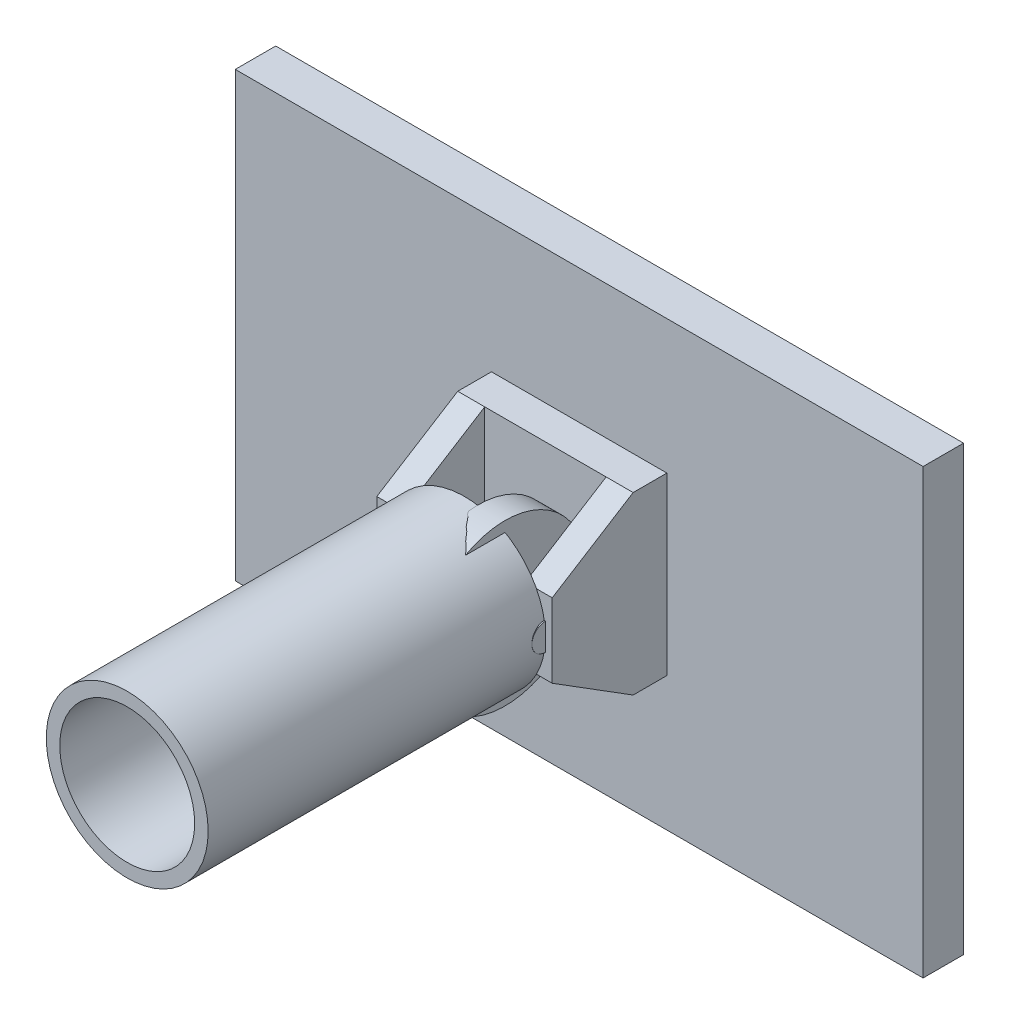
ISO-10303-21;
HEADER;
FILE_DESCRIPTION(('STEP AP214'),'2;1');
FILE_NAME('part.step','',(''),(''),'','','');
FILE_SCHEMA(('AUTOMOTIVE_DESIGN { 1 0 10303 214 1 1 1 1 }'));
ENDSEC;
DATA;
#1=APPLICATION_CONTEXT('core data for automotive mechanical design processes');
#2=APPLICATION_PROTOCOL_DEFINITION('international standard','automotive_design',2000,#1);
#3=PRODUCT_CONTEXT('',#1,'mechanical');
#4=PRODUCT('Part','Part','',(#3));
#5=PRODUCT_RELATED_PRODUCT_CATEGORY('part','',(#4));
#6=PRODUCT_DEFINITION_FORMATION('','',#4);
#7=PRODUCT_DEFINITION_CONTEXT('part definition',#1,'design');
#8=PRODUCT_DEFINITION('design','',#6,#7);
#9=PRODUCT_DEFINITION_SHAPE('','',#8);
#10=(LENGTH_UNIT() NAMED_UNIT(*) SI_UNIT(.MILLI.,.METRE.));
#11=(NAMED_UNIT(*) PLANE_ANGLE_UNIT() SI_UNIT($,.RADIAN.));
#12=(NAMED_UNIT(*) SI_UNIT($,.STERADIAN.) SOLID_ANGLE_UNIT());
#13=UNCERTAINTY_MEASURE_WITH_UNIT(LENGTH_MEASURE(1.E-05),#10,'distance_accuracy_value','');
#14=(GEOMETRIC_REPRESENTATION_CONTEXT(3) GLOBAL_UNCERTAINTY_ASSIGNED_CONTEXT((#13)) GLOBAL_UNIT_ASSIGNED_CONTEXT((#10,
#11,#12)) REPRESENTATION_CONTEXT('',''));
#15=CARTESIAN_POINT('',(0.,0.,0.));
#16=DIRECTION('',(0.,0.,1.));
#17=DIRECTION('',(1.,0.,0.));
#18=AXIS2_PLACEMENT_3D('',#15,#16,#17);
#19=CARTESIAN_POINT('',(-8.,0.,23.));
#20=DIRECTION('',(1.,0.,0.));
#21=DIRECTION('',(0.,0.,-1.));
#22=AXIS2_PLACEMENT_3D('',#19,#20,#21);
#23=CYLINDRICAL_SURFACE('',#22,4.125);
#24=CARTESIAN_POINT('',(-8.,0.,23.));
#25=DIRECTION('',(1.,0.,0.));
#26=DIRECTION('',(0.,0.,-1.));
#27=AXIS2_PLACEMENT_3D('',#24,#25,#26);
#28=CIRCLE('',#27,4.125);
#29=CARTESIAN_POINT('',(-8.,0.,18.875));
#30=VERTEX_POINT('',#29);
#31=EDGE_CURVE('E12',#30,#30,#28,.T.);
#32=ORIENTED_EDGE('',*,*,#31,.T.);
#33=EDGE_LOOP('',(#32));
#34=FACE_BOUND('',#33,.T.);
#35=CARTESIAN_POINT('',(-1.,0.,23.));
#36=DIRECTION('',(1.,0.,0.));
#37=DIRECTION('',(0.,0.,-1.));
#38=AXIS2_PLACEMENT_3D('',#35,#36,#37);
#39=CIRCLE('',#38,4.125);
#40=CARTESIAN_POINT('',(-1.,0.,18.875));
#41=VERTEX_POINT('',#40);
#42=EDGE_CURVE('E51',#41,#41,#39,.T.);
#43=ORIENTED_EDGE('',*,*,#42,.F.);
#44=EDGE_LOOP('',(#43));
#45=FACE_BOUND('',#44,.T.);
#46=ADVANCED_FACE('F48',(#34,#45),#23,.T.);
#47=CARTESIAN_POINT('',(-8.,0.,23.));
#48=DIRECTION('',(1.,0.,0.));
#49=DIRECTION('',(0.,0.,-1.));
#50=AXIS2_PLACEMENT_3D('',#47,#48,#49);
#51=PLANE('',#50);
#52=ORIENTED_EDGE('',*,*,#31,.F.);
#53=EDGE_LOOP('',(#52));
#54=FACE_BOUND('',#53,.T.);
#55=ADVANCED_FACE('F63',(#54),#51,.F.);
#56=CARTESIAN_POINT('',(-1.,0.,23.));
#57=DIRECTION('',(1.,0.,0.));
#58=DIRECTION('',(0.,0.,-1.));
#59=AXIS2_PLACEMENT_3D('',#56,#57,#58);
#60=PLANE('',#59);
#61=ORIENTED_EDGE('',*,*,#42,.T.);
#62=EDGE_LOOP('',(#61));
#63=FACE_BOUND('',#62,.T.);
#64=ADVANCED_FACE('F60',(#63),#60,.T.);
#65=CLOSED_SHELL('',(#46,#55,#64));
#66=MANIFOLD_SOLID_BREP('B2',#65);
#67=CARTESIAN_POINT('',(12.,0.,23.));
#68=DIRECTION('',(-1.,0.,0.));
#69=DIRECTION('',(0.,0.,1.));
#70=AXIS2_PLACEMENT_3D('',#67,#68,#69);
#71=CYLINDRICAL_SURFACE('',#70,2.);
#72=CARTESIAN_POINT('',(12.,0.,23.));
#73=DIRECTION('',(1.,0.,0.));
#74=DIRECTION('',(0.,0.,-1.));
#75=AXIS2_PLACEMENT_3D('',#72,#73,#74);
#76=CIRCLE('',#75,2.);
#77=CARTESIAN_POINT('',(12.,0.,21.));
#78=VERTEX_POINT('',#77);
#79=EDGE_CURVE('E47',#78,#78,#76,.T.);
#80=ORIENTED_EDGE('',*,*,#79,.F.);
#81=EDGE_LOOP('',(#80));
#82=FACE_BOUND('',#81,.T.);
#83=CARTESIAN_POINT('',(-12.,0.,23.));
#84=DIRECTION('',(1.,0.,0.));
#85=DIRECTION('',(0.,0.,-1.));
#86=AXIS2_PLACEMENT_3D('',#83,#84,#85);
#87=CIRCLE('',#86,2.);
#88=CARTESIAN_POINT('',(-12.,0.,21.));
#89=VERTEX_POINT('',#88);
#90=EDGE_CURVE('E100',#89,#89,#87,.T.);
#91=ORIENTED_EDGE('',*,*,#90,.T.);
#92=EDGE_LOOP('',(#91));
#93=FACE_BOUND('',#92,.T.);
#94=ADVANCED_FACE('F97',(#82,#93),#71,.T.);
#95=CARTESIAN_POINT('',(12.,0.,23.));
#96=DIRECTION('',(1.,0.,0.));
#97=DIRECTION('',(0.,0.,-1.));
#98=AXIS2_PLACEMENT_3D('',#95,#96,#97);
#99=PLANE('',#98);
#100=ORIENTED_EDGE('',*,*,#79,.T.);
#101=EDGE_LOOP('',(#100));
#102=FACE_BOUND('',#101,.T.);
#103=ADVANCED_FACE('F112',(#102),#99,.T.);
#104=CARTESIAN_POINT('',(-12.,0.,23.));
#105=DIRECTION('',(1.,0.,0.));
#106=DIRECTION('',(0.,0.,-1.));
#107=AXIS2_PLACEMENT_3D('',#104,#105,#106);
#108=PLANE('',#107);
#109=ORIENTED_EDGE('',*,*,#90,.F.);
#110=EDGE_LOOP('',(#109));
#111=FACE_BOUND('',#110,.T.);
#112=ADVANCED_FACE('F110',(#111),#108,.F.);
#113=CLOSED_SHELL('',(#94,#103,#112));
#114=MANIFOLD_SOLID_BREP('B7',#113);
#115=CARTESIAN_POINT('',(6.,0.,23.));
#116=DIRECTION('',(-1.,0.,0.));
#117=DIRECTION('',(0.,0.,1.));
#118=AXIS2_PLACEMENT_3D('',#115,#116,#117);
#119=CYLINDRICAL_SURFACE('',#118,11.91);
#120=CARTESIAN_POINT('',(6.,0.,23.));
#121=DIRECTION('',(1.,0.,0.));
#122=DIRECTION('',(0.,0.,-1.));
#123=AXIS2_PLACEMENT_3D('',#120,#121,#122);
#124=CIRCLE('',#123,11.91);
#125=CARTESIAN_POINT('',(6.,0.,11.09));
#126=VERTEX_POINT('',#125);
#127=EDGE_CURVE('E96',#126,#126,#124,.T.);
#128=ORIENTED_EDGE('',*,*,#127,.F.);
#129=EDGE_LOOP('',(#128));
#130=FACE_BOUND('',#129,.T.);
#131=CARTESIAN_POINT('',(2.,0.,23.));
#132=DIRECTION('',(1.,0.,0.));
#133=DIRECTION('',(0.,0.,-1.));
#134=AXIS2_PLACEMENT_3D('',#131,#132,#133);
#135=CIRCLE('',#134,11.91);
#136=CARTESIAN_POINT('',(2.,0.,11.09));
#137=VERTEX_POINT('',#136);
#138=EDGE_CURVE('E149',#137,#137,#135,.T.);
#139=ORIENTED_EDGE('',*,*,#138,.T.);
#140=EDGE_LOOP('',(#139));
#141=FACE_BOUND('',#140,.T.);
#142=ADVANCED_FACE('F146',(#130,#141),#119,.T.);
#143=CARTESIAN_POINT('',(6.,0.,23.));
#144=DIRECTION('',(1.,0.,0.));
#145=DIRECTION('',(0.,0.,-1.));
#146=AXIS2_PLACEMENT_3D('',#143,#144,#145);
#147=PLANE('',#146);
#148=ORIENTED_EDGE('',*,*,#127,.T.);
#149=EDGE_LOOP('',(#148));
#150=FACE_BOUND('',#149,.T.);
#151=ADVANCED_FACE('F161',(#150),#147,.T.);
#152=CARTESIAN_POINT('',(2.,0.,23.));
#153=DIRECTION('',(1.,0.,0.));
#154=DIRECTION('',(0.,0.,-1.));
#155=AXIS2_PLACEMENT_3D('',#152,#153,#154);
#156=PLANE('',#155);
#157=ORIENTED_EDGE('',*,*,#138,.F.);
#158=EDGE_LOOP('',(#157));
#159=FACE_BOUND('',#158,.T.);
#160=ADVANCED_FACE('F159',(#159),#156,.F.);
#161=CLOSED_SHELL('',(#142,#151,#160));
#162=MANIFOLD_SOLID_BREP('B42',#161);
#163=CARTESIAN_POINT('',(0.,0.,16.));
#164=DIRECTION('',(0.,0.,-1.));
#165=DIRECTION('',(-1.,0.,0.));
#166=AXIS2_PLACEMENT_3D('',#163,#164,#165);
#167=CYLINDRICAL_SURFACE('',#166,1.75);
#168=CARTESIAN_POINT('',(0.,0.,16.));
#169=DIRECTION('',(0.,0.,1.));
#170=DIRECTION('',(1.,0.,0.));
#171=AXIS2_PLACEMENT_3D('',#168,#169,#170);
#172=CIRCLE('',#171,1.75);
#173=CARTESIAN_POINT('',(1.75,0.,16.));
#174=VERTEX_POINT('',#173);
#175=EDGE_CURVE('E145',#174,#174,#172,.T.);
#176=ORIENTED_EDGE('',*,*,#175,.F.);
#177=EDGE_LOOP('',(#176));
#178=FACE_BOUND('',#177,.T.);
#179=CARTESIAN_POINT('',(0.,0.,11.));
#180=DIRECTION('',(0.,0.,1.));
#181=DIRECTION('',(1.,0.,0.));
#182=AXIS2_PLACEMENT_3D('',#179,#180,#181);
#183=CIRCLE('',#182,1.75);
#184=CARTESIAN_POINT('',(1.75,0.,11.));
#185=VERTEX_POINT('',#184);
#186=EDGE_CURVE('E198',#185,#185,#183,.T.);
#187=ORIENTED_EDGE('',*,*,#186,.T.);
#188=EDGE_LOOP('',(#187));
#189=FACE_BOUND('',#188,.T.);
#190=ADVANCED_FACE('F195',(#178,#189),#167,.T.);
#191=CARTESIAN_POINT('',(0.,0.,16.));
#192=DIRECTION('',(0.,0.,1.));
#193=DIRECTION('',(1.,0.,0.));
#194=AXIS2_PLACEMENT_3D('',#191,#192,#193);
#195=PLANE('',#194);
#196=ORIENTED_EDGE('',*,*,#175,.T.);
#197=EDGE_LOOP('',(#196));
#198=FACE_BOUND('',#197,.T.);
#199=ADVANCED_FACE('F210',(#198),#195,.T.);
#200=CARTESIAN_POINT('',(0.,0.,11.));
#201=DIRECTION('',(0.,0.,1.));
#202=DIRECTION('',(1.,0.,0.));
#203=AXIS2_PLACEMENT_3D('',#200,#201,#202);
#204=PLANE('',#203);
#205=ORIENTED_EDGE('',*,*,#186,.F.);
#206=EDGE_LOOP('',(#205));
#207=FACE_BOUND('',#206,.T.);
#208=ADVANCED_FACE('F208',(#207),#204,.F.);
#209=CLOSED_SHELL('',(#190,#199,#208));
#210=MANIFOLD_SOLID_BREP('B91',#209);
#211=CARTESIAN_POINT('',(0.,0.,73.));
#212=DIRECTION('',(0.,0.,1.));
#213=DIRECTION('',(1.,0.,0.));
#214=AXIS2_PLACEMENT_3D('',#211,#212,#213);
#215=PLANE('',#214);
#216=CARTESIAN_POINT('',(0.,0.,73.));
#217=DIRECTION('',(0.,0.,1.));
#218=DIRECTION('',(1.,0.,0.));
#219=AXIS2_PLACEMENT_3D('',#216,#217,#218);
#220=CIRCLE('',#219,12.);
#221=CARTESIAN_POINT('',(12.,0.,73.));
#222=VERTEX_POINT('',#221);
#223=EDGE_CURVE('E194',#222,#222,#220,.T.);
#224=ORIENTED_EDGE('',*,*,#223,.T.);
#225=EDGE_LOOP('',(#224));
#226=FACE_BOUND('',#225,.T.);
#227=CARTESIAN_POINT('',(0.,0.,73.));
#228=DIRECTION('',(0.,0.,1.));
#229=DIRECTION('',(1.,0.,0.));
#230=AXIS2_PLACEMENT_3D('',#227,#228,#229);
#231=CIRCLE('',#230,10.);
#232=CARTESIAN_POINT('',(10.,0.,73.));
#233=VERTEX_POINT('',#232);
#234=EDGE_CURVE('E257',#233,#233,#231,.T.);
#235=ORIENTED_EDGE('',*,*,#234,.F.);
#236=EDGE_LOOP('',(#235));
#237=FACE_BOUND('',#236,.T.);
#238=ADVANCED_FACE('F246',(#226,#237),#215,.T.);
#239=CARTESIAN_POINT('',(0.,0.,23.));
#240=DIRECTION('',(0.,0.,1.));
#241=DIRECTION('',(1.,0.,0.));
#242=AXIS2_PLACEMENT_3D('',#239,#240,#241);
#243=PLANE('',#242);
#244=CARTESIAN_POINT('',(0.,0.,23.));
#245=DIRECTION('',(0.,0.,1.));
#246=DIRECTION('',(1.,0.,0.));
#247=AXIS2_PLACEMENT_3D('',#244,#245,#246);
#248=CIRCLE('',#247,12.);
#249=CARTESIAN_POINT('',(12.,0.,23.));
#250=VERTEX_POINT('',#249);
#251=EDGE_CURVE('E250',#250,#250,#248,.T.);
#252=ORIENTED_EDGE('',*,*,#251,.F.);
#253=EDGE_LOOP('',(#252));
#254=FACE_BOUND('',#253,.T.);
#255=CARTESIAN_POINT('',(0.,0.,23.));
#256=DIRECTION('',(0.,0.,1.));
#257=DIRECTION('',(1.,0.,0.));
#258=AXIS2_PLACEMENT_3D('',#255,#256,#257);
#259=CIRCLE('',#258,10.);
#260=CARTESIAN_POINT('',(10.,0.,23.));
#261=VERTEX_POINT('',#260);
#262=EDGE_CURVE('E259',#261,#261,#259,.T.);
#263=ORIENTED_EDGE('',*,*,#262,.T.);
#264=EDGE_LOOP('',(#263));
#265=FACE_BOUND('',#264,.T.);
#266=ADVANCED_FACE('F269',(#254,#265),#243,.F.);
#267=CARTESIAN_POINT('',(0.,0.,73.));
#268=DIRECTION('',(0.,0.,-1.));
#269=DIRECTION('',(-1.,0.,0.));
#270=AXIS2_PLACEMENT_3D('',#267,#268,#269);
#271=CYLINDRICAL_SURFACE('',#270,12.);
#272=ORIENTED_EDGE('',*,*,#223,.F.);
#273=EDGE_LOOP('',(#272));
#274=FACE_BOUND('',#273,.T.);
#275=ORIENTED_EDGE('',*,*,#251,.T.);
#276=EDGE_LOOP('',(#275));
#277=FACE_BOUND('',#276,.T.);
#278=ADVANCED_FACE('F248',(#274,#277),#271,.T.);
#279=CARTESIAN_POINT('',(0.,0.,73.));
#280=DIRECTION('',(0.,0.,-1.));
#281=DIRECTION('',(-1.,0.,0.));
#282=AXIS2_PLACEMENT_3D('',#279,#280,#281);
#283=CYLINDRICAL_SURFACE('',#282,10.);
#284=ORIENTED_EDGE('',*,*,#234,.T.);
#285=EDGE_LOOP('',(#284));
#286=FACE_BOUND('',#285,.T.);
#287=ORIENTED_EDGE('',*,*,#262,.F.);
#288=EDGE_LOOP('',(#287));
#289=FACE_BOUND('',#288,.T.);
#290=ADVANCED_FACE('F265',(#286,#289),#283,.F.);
#291=CLOSED_SHELL('',(#238,#266,#278,#290));
#292=MANIFOLD_SOLID_BREP('B140',#291);
#293=CARTESIAN_POINT('',(0.,0.,11.));
#294=DIRECTION('',(0.,0.,1.));
#295=DIRECTION('',(1.,0.,0.));
#296=AXIS2_PLACEMENT_3D('',#293,#294,#295);
#297=PLANE('',#296);
#298=DIRECTION('',(0.,1.,0.));
#299=VECTOR('',#298,1.);
#300=CARTESIAN_POINT('',(-9.,-13.,11.));
#301=LINE('',#300,#299);
#302=CARTESIAN_POINT('',(-8.99999999999999,-13.,11.));
#303=VERTEX_POINT('',#302);
#304=CARTESIAN_POINT('',(-8.99999999999999,13.,11.));
#305=VERTEX_POINT('',#304);
#306=EDGE_CURVE('E332',#303,#305,#301,.T.);
#307=ORIENTED_EDGE('',*,*,#306,.F.);
#308=DIRECTION('',(1.,0.,0.));
#309=VECTOR('',#308,1.);
#310=CARTESIAN_POINT('',(13.,-13.,11.));
#311=LINE('',#310,#309);
#312=CARTESIAN_POINT('',(9.,-13.,11.));
#313=VERTEX_POINT('',#312);
#314=EDGE_CURVE('E459',#303,#313,#311,.T.);
#315=ORIENTED_EDGE('',*,*,#314,.T.);
#316=DIRECTION('',(0.,1.,0.));
#317=VECTOR('',#316,1.);
#318=CARTESIAN_POINT('',(9.,-13.,11.));
#319=LINE('',#318,#317);
#320=CARTESIAN_POINT('',(9.,13.,11.));
#321=VERTEX_POINT('',#320);
#322=EDGE_CURVE('E438',#313,#321,#319,.T.);
#323=ORIENTED_EDGE('',*,*,#322,.T.);
#324=DIRECTION('',(-1.,0.,0.));
#325=VECTOR('',#324,1.);
#326=CARTESIAN_POINT('',(13.,13.,11.));
#327=LINE('',#326,#325);
#328=EDGE_CURVE('E458',#321,#305,#327,.T.);
#329=ORIENTED_EDGE('',*,*,#328,.T.);
#330=EDGE_LOOP('',(#307,#315,#323,#329));
#331=FACE_BOUND('',#330,.T.);
#332=ADVANCED_FACE('F317',(#331),#297,.T.);
#333=CARTESIAN_POINT('',(-13.,-13.,11.));
#334=DIRECTION('',(1.,0.,0.));
#335=DIRECTION('',(0.,0.,-1.));
#336=AXIS2_PLACEMENT_3D('',#333,#334,#335);
#337=PLANE('',#336);
#338=DIRECTION('',(0.,-1.,0.));
#339=VECTOR('',#338,1.);
#340=CARTESIAN_POINT('',(-13.,-13.,6.));
#341=LINE('',#340,#339);
#342=CARTESIAN_POINT('',(-13.,13.,6.));
#343=VERTEX_POINT('',#342);
#344=CARTESIAN_POINT('',(-13.,-13.,6.));
#345=VERTEX_POINT('',#344);
#346=EDGE_CURVE('E454',#343,#345,#341,.T.);
#347=ORIENTED_EDGE('',*,*,#346,.T.);
#348=DIRECTION('',(0.,0.,-1.));
#349=VECTOR('',#348,1.);
#350=CARTESIAN_POINT('',(-13.,-13.,11.));
#351=LINE('',#350,#349);
#352=CARTESIAN_POINT('',(-13.,-13.,11.));
#353=VERTEX_POINT('',#352);
#354=EDGE_CURVE('E325',#353,#345,#351,.T.);
#355=ORIENTED_EDGE('',*,*,#354,.F.);
#356=DIRECTION('',(0.,0.530660605191401,0.847584404114361));
#357=VECTOR('',#356,1.);
#358=CARTESIAN_POINT('',(-13.,-13.,11.));
#359=LINE('',#358,#357);
#360=CARTESIAN_POINT('',(-13.,-5.48696975618535,23.));
#361=VERTEX_POINT('',#360);
#362=EDGE_CURVE('E419',#353,#361,#359,.T.);
#363=ORIENTED_EDGE('',*,*,#362,.T.);
#364=DIRECTION('',(0.,1.,0.));
#365=VECTOR('',#364,1.);
#366=CARTESIAN_POINT('',(-13.,-5.48696975618535,23.));
#367=LINE('',#366,#365);
#368=CARTESIAN_POINT('',(-13.,5.48696975618536,23.));
#369=VERTEX_POINT('',#368);
#370=EDGE_CURVE('E424',#361,#369,#367,.T.);
#371=ORIENTED_EDGE('',*,*,#370,.T.);
#372=DIRECTION('',(0.,0.530660605191401,-0.847584404114361));
#373=VECTOR('',#372,1.);
#374=CARTESIAN_POINT('',(-13.,5.48696975618536,23.));
#375=LINE('',#374,#373);
#376=CARTESIAN_POINT('',(-13.,13.,11.));
#377=VERTEX_POINT('',#376);
#378=EDGE_CURVE('E400',#369,#377,#375,.T.);
#379=ORIENTED_EDGE('',*,*,#378,.T.);
#380=DIRECTION('',(0.,0.,-1.));
#381=VECTOR('',#380,1.);
#382=CARTESIAN_POINT('',(-13.,13.,11.));
#383=LINE('',#382,#381);
#384=EDGE_CURVE('E462',#377,#343,#383,.T.);
#385=ORIENTED_EDGE('',*,*,#384,.T.);
#386=EDGE_LOOP('',(#347,#355,#363,#371,#379,#385));
#387=FACE_BOUND('',#386,.T.);
#388=ADVANCED_FACE('F319',(#387),#337,.F.);
#389=CARTESIAN_POINT('',(13.,-13.,11.));
#390=DIRECTION('',(0.,1.,0.));
#391=DIRECTION('',(-1.,0.,0.));
#392=AXIS2_PLACEMENT_3D('',#389,#390,#391);
#393=PLANE('',#392);
#394=DIRECTION('',(1.,0.,0.));
#395=VECTOR('',#394,1.);
#396=CARTESIAN_POINT('',(13.,-13.,6.));
#397=LINE('',#396,#395);
#398=CARTESIAN_POINT('',(13.,-13.,6.));
#399=VERTEX_POINT('',#398);
#400=EDGE_CURVE('E465',#345,#399,#397,.T.);
#401=ORIENTED_EDGE('',*,*,#400,.T.);
#402=DIRECTION('',(0.,0.,-1.));
#403=VECTOR('',#402,1.);
#404=CARTESIAN_POINT('',(13.,-13.,11.));
#405=LINE('',#404,#403);
#406=CARTESIAN_POINT('',(13.,-13.,11.));
#407=VERTEX_POINT('',#406);
#408=EDGE_CURVE('E476',#407,#399,#405,.T.);
#409=ORIENTED_EDGE('',*,*,#408,.F.);
#410=DIRECTION('',(1.,0.,0.));
#411=VECTOR('',#410,1.);
#412=CARTESIAN_POINT('',(9.,-13.,11.));
#413=LINE('',#412,#411);
#414=EDGE_CURVE('E441',#313,#407,#413,.T.);
#415=ORIENTED_EDGE('',*,*,#414,.F.);
#416=ORIENTED_EDGE('',*,*,#314,.F.);
#417=EDGE_CURVE('E455',#353,#303,#311,.T.);
#418=ORIENTED_EDGE('',*,*,#417,.F.);
#419=ORIENTED_EDGE('',*,*,#354,.T.);
#420=EDGE_LOOP('',(#401,#409,#415,#416,#418,#419));
#421=FACE_BOUND('',#420,.T.);
#422=ADVANCED_FACE('F481',(#421),#393,.F.);
#423=CARTESIAN_POINT('',(13.,-13.,11.));
#424=DIRECTION('',(-1.,0.,0.));
#425=DIRECTION('',(0.,0.,1.));
#426=AXIS2_PLACEMENT_3D('',#423,#424,#425);
#427=PLANE('',#426);
#428=DIRECTION('',(0.,1.,0.));
#429=VECTOR('',#428,1.);
#430=CARTESIAN_POINT('',(13.,-13.,6.));
#431=LINE('',#430,#429);
#432=CARTESIAN_POINT('',(13.,13.,6.));
#433=VERTEX_POINT('',#432);
#434=EDGE_CURVE('E467',#399,#433,#431,.T.);
#435=ORIENTED_EDGE('',*,*,#434,.T.);
#436=DIRECTION('',(0.,0.,-1.));
#437=VECTOR('',#436,1.);
#438=CARTESIAN_POINT('',(13.,13.,11.));
#439=LINE('',#438,#437);
#440=CARTESIAN_POINT('',(13.,13.,11.));
#441=VERTEX_POINT('',#440);
#442=EDGE_CURVE('E473',#441,#433,#439,.T.);
#443=ORIENTED_EDGE('',*,*,#442,.F.);
#444=DIRECTION('',(0.,0.530660605191401,-0.847584404114361));
#445=VECTOR('',#444,1.);
#446=CARTESIAN_POINT('',(13.,5.48696975618536,23.));
#447=LINE('',#446,#445);
#448=CARTESIAN_POINT('',(13.,5.48696975618536,23.));
#449=VERTEX_POINT('',#448);
#450=EDGE_CURVE('E433',#449,#441,#447,.T.);
#451=ORIENTED_EDGE('',*,*,#450,.F.);
#452=DIRECTION('',(0.,1.,0.));
#453=VECTOR('',#452,1.);
#454=CARTESIAN_POINT('',(13.,-5.48696975618535,23.));
#455=LINE('',#454,#453);
#456=CARTESIAN_POINT('',(13.,-5.48696975618535,23.));
#457=VERTEX_POINT('',#456);
#458=EDGE_CURVE('E444',#457,#449,#455,.T.);
#459=ORIENTED_EDGE('',*,*,#458,.F.);
#460=DIRECTION('',(0.,0.530660605191401,0.847584404114361));
#461=VECTOR('',#460,1.);
#462=CARTESIAN_POINT('',(13.,-13.,11.));
#463=LINE('',#462,#461);
#464=EDGE_CURVE('E428',#407,#457,#463,.T.);
#465=ORIENTED_EDGE('',*,*,#464,.F.);
#466=ORIENTED_EDGE('',*,*,#408,.T.);
#467=EDGE_LOOP('',(#435,#443,#451,#459,#465,#466));
#468=FACE_BOUND('',#467,.T.);
#469=ADVANCED_FACE('F492',(#468),#427,.F.);
#470=CARTESIAN_POINT('',(13.,13.,11.));
#471=DIRECTION('',(0.,-1.,0.));
#472=DIRECTION('',(1.,0.,0.));
#473=AXIS2_PLACEMENT_3D('',#470,#471,#472);
#474=PLANE('',#473);
#475=DIRECTION('',(-1.,0.,0.));
#476=VECTOR('',#475,1.);
#477=CARTESIAN_POINT('',(13.,13.,6.));
#478=LINE('',#477,#476);
#479=EDGE_CURVE('E469',#433,#343,#478,.T.);
#480=ORIENTED_EDGE('',*,*,#479,.T.);
#481=ORIENTED_EDGE('',*,*,#384,.F.);
#482=DIRECTION('',(-1.,0.,0.));
#483=VECTOR('',#482,1.);
#484=CARTESIAN_POINT('',(-9.,13.,11.));
#485=LINE('',#484,#483);
#486=EDGE_CURVE('E340',#305,#377,#485,.T.);
#487=ORIENTED_EDGE('',*,*,#486,.F.);
#488=ORIENTED_EDGE('',*,*,#328,.F.);
#489=EDGE_CURVE('E460',#441,#321,#327,.T.);
#490=ORIENTED_EDGE('',*,*,#489,.F.);
#491=ORIENTED_EDGE('',*,*,#442,.T.);
#492=EDGE_LOOP('',(#480,#481,#487,#488,#490,#491));
#493=FACE_BOUND('',#492,.T.);
#494=ADVANCED_FACE('F496',(#493),#474,.F.);
#495=CARTESIAN_POINT('',(0.,0.,6.));
#496=DIRECTION('',(0.,0.,1.));
#497=DIRECTION('',(1.,0.,0.));
#498=AXIS2_PLACEMENT_3D('',#495,#496,#497);
#499=PLANE('',#498);
#500=CARTESIAN_POINT('',(0.,0.,6.));
#501=DIRECTION('',(0.,0.,1.));
#502=DIRECTION('',(1.,0.,0.));
#503=AXIS2_PLACEMENT_3D('',#500,#501,#502);
#504=CIRCLE('',#503,7.5);
#505=CARTESIAN_POINT('',(7.5,0.,6.));
#506=VERTEX_POINT('',#505);
#507=EDGE_CURVE('E244',#506,#506,#504,.F.);
#508=ORIENTED_EDGE('',*,*,#507,.F.);
#509=EDGE_LOOP('',(#508));
#510=FACE_BOUND('',#509,.T.);
#511=ORIENTED_EDGE('',*,*,#346,.F.);
#512=ORIENTED_EDGE('',*,*,#479,.F.);
#513=ORIENTED_EDGE('',*,*,#434,.F.);
#514=ORIENTED_EDGE('',*,*,#400,.F.);
#515=EDGE_LOOP('',(#511,#512,#513,#514));
#516=FACE_BOUND('',#515,.T.);
#517=ADVANCED_FACE('F488',(#510,#516),#499,.F.);
#518=CARTESIAN_POINT('',(9.,-13.,11.));
#519=DIRECTION('',(0.,0.847584404114361,-0.530660605191401));
#520=DIRECTION('',(0.,0.530660605191401,0.847584404114361));
#521=AXIS2_PLACEMENT_3D('',#518,#519,#520);
#522=PLANE('',#521);
#523=ORIENTED_EDGE('',*,*,#464,.T.);
#524=DIRECTION('',(1.,0.,0.));
#525=VECTOR('',#524,1.);
#526=CARTESIAN_POINT('',(9.,-5.48696975618535,23.));
#527=LINE('',#526,#525);
#528=CARTESIAN_POINT('',(9.,-5.48696975618535,23.));
#529=VERTEX_POINT('',#528);
#530=EDGE_CURVE('E451',#529,#457,#527,.T.);
#531=ORIENTED_EDGE('',*,*,#530,.F.);
#532=DIRECTION('',(0.,0.530660605191401,0.847584404114361));
#533=VECTOR('',#532,1.);
#534=CARTESIAN_POINT('',(9.,-13.,11.));
#535=LINE('',#534,#533);
#536=EDGE_CURVE('E429',#313,#529,#535,.T.);
#537=ORIENTED_EDGE('',*,*,#536,.F.);
#538=ORIENTED_EDGE('',*,*,#414,.T.);
#539=EDGE_LOOP('',(#523,#531,#537,#538));
#540=FACE_BOUND('',#539,.T.);
#541=ADVANCED_FACE('F508',(#540),#522,.F.);
#542=CARTESIAN_POINT('',(9.,-5.48696975618535,23.));
#543=DIRECTION('',(0.,0.,-1.));
#544=DIRECTION('',(-1.,0.,0.));
#545=AXIS2_PLACEMENT_3D('',#542,#543,#544);
#546=PLANE('',#545);
#547=ORIENTED_EDGE('',*,*,#458,.T.);
#548=DIRECTION('',(1.,0.,0.));
#549=VECTOR('',#548,1.);
#550=CARTESIAN_POINT('',(9.,5.48696975618536,23.));
#551=LINE('',#550,#549);
#552=CARTESIAN_POINT('',(9.,5.48696975618536,23.));
#553=VERTEX_POINT('',#552);
#554=EDGE_CURVE('E448',#553,#449,#551,.T.);
#555=ORIENTED_EDGE('',*,*,#554,.F.);
#556=DIRECTION('',(0.,1.,0.));
#557=VECTOR('',#556,1.);
#558=CARTESIAN_POINT('',(9.,-5.48696975618535,23.));
#559=LINE('',#558,#557);
#560=EDGE_CURVE('E432',#529,#553,#559,.T.);
#561=ORIENTED_EDGE('',*,*,#560,.F.);
#562=ORIENTED_EDGE('',*,*,#530,.T.);
#563=EDGE_LOOP('',(#547,#555,#561,#562));
#564=FACE_BOUND('',#563,.T.);
#565=ADVANCED_FACE('F510',(#564),#546,.F.);
#566=CARTESIAN_POINT('',(9.,5.48696975618536,23.));
#567=DIRECTION('',(0.,-0.847584404114361,-0.530660605191401));
#568=DIRECTION('',(0.,0.530660605191401,-0.847584404114361));
#569=AXIS2_PLACEMENT_3D('',#566,#567,#568);
#570=PLANE('',#569);
#571=ORIENTED_EDGE('',*,*,#450,.T.);
#572=ORIENTED_EDGE('',*,*,#489,.T.);
#573=DIRECTION('',(0.,0.530660605191401,-0.847584404114361));
#574=VECTOR('',#573,1.);
#575=CARTESIAN_POINT('',(9.,5.48696975618536,23.));
#576=LINE('',#575,#574);
#577=EDGE_CURVE('E435',#553,#321,#576,.T.);
#578=ORIENTED_EDGE('',*,*,#577,.F.);
#579=ORIENTED_EDGE('',*,*,#554,.T.);
#580=EDGE_LOOP('',(#571,#572,#578,#579));
#581=FACE_BOUND('',#580,.T.);
#582=ADVANCED_FACE('F499',(#581),#570,.F.);
#583=CARTESIAN_POINT('',(9.,0.,0.));
#584=DIRECTION('',(-1.,0.,0.));
#585=DIRECTION('',(0.,0.,1.));
#586=AXIS2_PLACEMENT_3D('',#583,#584,#585);
#587=PLANE('',#586);
#588=ORIENTED_EDGE('',*,*,#536,.T.);
#589=ORIENTED_EDGE('',*,*,#560,.T.);
#590=ORIENTED_EDGE('',*,*,#577,.T.);
#591=ORIENTED_EDGE('',*,*,#322,.F.);
#592=EDGE_LOOP('',(#588,#589,#590,#591));
#593=FACE_BOUND('',#592,.T.);
#594=ADVANCED_FACE('F502',(#593),#587,.T.);
#595=CARTESIAN_POINT('',(-9.,-13.,11.));
#596=DIRECTION('',(0.,-0.847584404114361,0.530660605191401));
#597=DIRECTION('',(0.,-0.530660605191401,-0.847584404114361));
#598=AXIS2_PLACEMENT_3D('',#595,#596,#597);
#599=PLANE('',#598);
#600=ORIENTED_EDGE('',*,*,#362,.F.);
#601=ORIENTED_EDGE('',*,*,#417,.T.);
#602=DIRECTION('',(0.,0.530660605191401,0.847584404114361));
#603=VECTOR('',#602,1.);
#604=CARTESIAN_POINT('',(-9.,-13.,11.));
#605=LINE('',#604,#603);
#606=CARTESIAN_POINT('',(-9.,-5.48696975618535,23.));
#607=VERTEX_POINT('',#606);
#608=EDGE_CURVE('E425',#303,#607,#605,.T.);
#609=ORIENTED_EDGE('',*,*,#608,.T.);
#610=DIRECTION('',(-1.,0.,0.));
#611=VECTOR('',#610,1.);
#612=CARTESIAN_POINT('',(-9.,-5.48696975618535,23.));
#613=LINE('',#612,#611);
#614=EDGE_CURVE('E405',#607,#361,#613,.T.);
#615=ORIENTED_EDGE('',*,*,#614,.T.);
#616=EDGE_LOOP('',(#600,#601,#609,#615));
#617=FACE_BOUND('',#616,.T.);
#618=ADVANCED_FACE('F573',(#617),#599,.T.);
#619=CARTESIAN_POINT('',(-9.,5.48696975618536,23.));
#620=DIRECTION('',(0.,0.847584404114361,0.530660605191401));
#621=DIRECTION('',(0.,-0.530660605191401,0.847584404114361));
#622=AXIS2_PLACEMENT_3D('',#619,#620,#621);
#623=PLANE('',#622);
#624=ORIENTED_EDGE('',*,*,#378,.F.);
#625=DIRECTION('',(-1.,0.,0.));
#626=VECTOR('',#625,1.);
#627=CARTESIAN_POINT('',(-9.,5.48696975618536,23.));
#628=LINE('',#627,#626);
#629=CARTESIAN_POINT('',(-9.,5.48696975618536,23.));
#630=VERTEX_POINT('',#629);
#631=EDGE_CURVE('E395',#630,#369,#628,.T.);
#632=ORIENTED_EDGE('',*,*,#631,.F.);
#633=DIRECTION('',(0.,0.530660605191401,-0.847584404114361));
#634=VECTOR('',#633,1.);
#635=CARTESIAN_POINT('',(-9.,5.48696975618536,23.));
#636=LINE('',#635,#634);
#637=EDGE_CURVE('E398',#630,#305,#636,.T.);
#638=ORIENTED_EDGE('',*,*,#637,.T.);
#639=ORIENTED_EDGE('',*,*,#486,.T.);
#640=EDGE_LOOP('',(#624,#632,#638,#639));
#641=FACE_BOUND('',#640,.T.);
#642=ADVANCED_FACE('F397',(#641),#623,.T.);
#643=CARTESIAN_POINT('',(-9.,-5.48696975618535,23.));
#644=DIRECTION('',(0.,0.,1.));
#645=DIRECTION('',(1.,0.,0.));
#646=AXIS2_PLACEMENT_3D('',#643,#644,#645);
#647=PLANE('',#646);
#648=ORIENTED_EDGE('',*,*,#370,.F.);
#649=ORIENTED_EDGE('',*,*,#614,.F.);
#650=DIRECTION('',(0.,1.,0.));
#651=VECTOR('',#650,1.);
#652=CARTESIAN_POINT('',(-9.,-5.48696975618535,23.));
#653=LINE('',#652,#651);
#654=EDGE_CURVE('E411',#607,#630,#653,.T.);
#655=ORIENTED_EDGE('',*,*,#654,.T.);
#656=ORIENTED_EDGE('',*,*,#631,.T.);
#657=EDGE_LOOP('',(#648,#649,#655,#656));
#658=FACE_BOUND('',#657,.T.);
#659=ADVANCED_FACE('F413',(#658),#647,.T.);
#660=CARTESIAN_POINT('',(-9.,0.,0.));
#661=DIRECTION('',(1.,0.,0.));
#662=DIRECTION('',(0.,0.,1.));
#663=AXIS2_PLACEMENT_3D('',#660,#661,#662);
#664=PLANE('',#663);
#665=ORIENTED_EDGE('',*,*,#608,.F.);
#666=ORIENTED_EDGE('',*,*,#306,.T.);
#667=ORIENTED_EDGE('',*,*,#637,.F.);
#668=ORIENTED_EDGE('',*,*,#654,.F.);
#669=EDGE_LOOP('',(#665,#666,#667,#668));
#670=FACE_BOUND('',#669,.T.);
#671=ADVANCED_FACE('F410',(#670),#664,.T.);
#672=CARTESIAN_POINT('',(0.,0.,-4.));
#673=DIRECTION('',(0.,0.,1.));
#674=DIRECTION('',(1.,0.,0.));
#675=AXIS2_PLACEMENT_3D('',#672,#673,#674);
#676=CYLINDRICAL_SURFACE('',#675,7.5);
#677=CARTESIAN_POINT('',(0.,0.,-4.));
#678=DIRECTION('',(0.,0.,-1.));
#679=DIRECTION('',(-1.,0.,0.));
#680=AXIS2_PLACEMENT_3D('',#677,#678,#679);
#681=CIRCLE('',#680,7.5);
#682=CARTESIAN_POINT('',(-7.5,0.,-4.));
#683=VERTEX_POINT('',#682);
#684=EDGE_CURVE('E422',#683,#683,#681,.T.);
#685=ORIENTED_EDGE('',*,*,#684,.F.);
#686=EDGE_LOOP('',(#685));
#687=FACE_BOUND('',#686,.T.);
#688=ORIENTED_EDGE('',*,*,#507,.T.);
#689=EDGE_LOOP('',(#688));
#690=FACE_BOUND('',#689,.T.);
#691=ADVANCED_FACE('F615',(#687,#690),#676,.T.);
#692=CARTESIAN_POINT('',(0.,0.,-4.));
#693=DIRECTION('',(0.,0.,-1.));
#694=DIRECTION('',(-1.,0.,0.));
#695=AXIS2_PLACEMENT_3D('',#692,#693,#694);
#696=PLANE('',#695);
#697=CARTESIAN_POINT('',(0.,0.,-4.));
#698=DIRECTION('',(0.,0.,-1.));
#699=DIRECTION('',(-1.,0.,0.));
#700=AXIS2_PLACEMENT_3D('',#697,#698,#699);
#701=CIRCLE('',#700,3.34847661473733);
#702=CARTESIAN_POINT('',(-3.34847661473733,0.,-4.));
#703=VERTEX_POINT('',#702);
#704=EDGE_CURVE('E662',#703,#703,#701,.T.);
#705=ORIENTED_EDGE('',*,*,#704,.F.);
#706=EDGE_LOOP('',(#705));
#707=FACE_BOUND('',#706,.T.);
#708=ORIENTED_EDGE('',*,*,#684,.T.);
#709=EDGE_LOOP('',(#708));
#710=FACE_BOUND('',#709,.T.);
#711=ADVANCED_FACE('F622',(#707,#710),#696,.T.);
#712=CARTESIAN_POINT('',(0.,0.,-19.));
#713=DIRECTION('',(0.,0.,1.));
#714=DIRECTION('',(1.,0.,0.));
#715=AXIS2_PLACEMENT_3D('',#712,#713,#714);
#716=CYLINDRICAL_SURFACE('',#715,3.34847661473733);
#717=CARTESIAN_POINT('',(0.,0.,-19.));
#718=DIRECTION('',(0.,0.,-1.));
#719=DIRECTION('',(-1.,0.,0.));
#720=AXIS2_PLACEMENT_3D('',#717,#718,#719);
#721=CIRCLE('',#720,3.34847661473733);
#722=CARTESIAN_POINT('',(-3.34847661473733,0.,-19.));
#723=VERTEX_POINT('',#722);
#724=EDGE_CURVE('E661',#723,#723,#721,.T.);
#725=ORIENTED_EDGE('',*,*,#724,.F.);
#726=EDGE_LOOP('',(#725));
#727=FACE_BOUND('',#726,.T.);
#728=ORIENTED_EDGE('',*,*,#704,.T.);
#729=EDGE_LOOP('',(#728));
#730=FACE_BOUND('',#729,.T.);
#731=ADVANCED_FACE('F631',(#727,#730),#716,.T.);
#732=CARTESIAN_POINT('',(0.,0.,-19.));
#733=DIRECTION('',(0.,0.,-1.));
#734=DIRECTION('',(-1.,0.,0.));
#735=AXIS2_PLACEMENT_3D('',#732,#733,#734);
#736=PLANE('',#735);
#737=ORIENTED_EDGE('',*,*,#724,.T.);
#738=EDGE_LOOP('',(#737));
#739=FACE_BOUND('',#738,.T.);
#740=ADVANCED_FACE('F640',(#739),#736,.T.);
#741=CLOSED_SHELL('',(#332,#388,#422,#469,#494,#517,#541,#565,#582,#594,#618,#642,#659,#671,
#691,#711,#731,#740));
#742=MANIFOLD_SOLID_BREP('B189',#741);
#743=CARTESIAN_POINT('',(0.,0.,0.));
#744=DIRECTION('',(0.,0.,1.));
#745=DIRECTION('',(1.,0.,0.));
#746=AXIS2_PLACEMENT_3D('',#743,#744,#745);
#747=PLANE('',#746);
#748=DIRECTION('',(0.,-1.,0.));
#749=VECTOR('',#748,1.);
#750=CARTESIAN_POINT('',(-50.9839681836116,-32.83303014356,0.));
#751=LINE('',#750,#749);
#752=CARTESIAN_POINT('',(-50.9839681836116,32.83303014356,0.));
#753=VERTEX_POINT('',#752);
#754=CARTESIAN_POINT('',(-50.9839681836116,-32.83303014356,0.));
#755=VERTEX_POINT('',#754);
#756=EDGE_CURVE('E775',#753,#755,#751,.T.);
#757=ORIENTED_EDGE('',*,*,#756,.F.);
#758=DIRECTION('',(-1.,0.,0.));
#759=VECTOR('',#758,1.);
#760=CARTESIAN_POINT('',(50.9839681836116,32.83303014356,0.));
#761=LINE('',#760,#759);
#762=CARTESIAN_POINT('',(50.9839681836116,32.83303014356,0.));
#763=VERTEX_POINT('',#762);
#764=EDGE_CURVE('E788',#763,#753,#761,.T.);
#765=ORIENTED_EDGE('',*,*,#764,.F.);
#766=DIRECTION('',(0.,1.,0.));
#767=VECTOR('',#766,1.);
#768=CARTESIAN_POINT('',(50.9839681836116,-32.83303014356,0.));
#769=LINE('',#768,#767);
#770=CARTESIAN_POINT('',(50.9839681836116,-32.83303014356,0.));
#771=VERTEX_POINT('',#770);
#772=EDGE_CURVE('E796',#771,#763,#769,.T.);
#773=ORIENTED_EDGE('',*,*,#772,.F.);
#774=DIRECTION('',(1.,0.,0.));
#775=VECTOR('',#774,1.);
#776=CARTESIAN_POINT('',(50.9839681836116,-32.83303014356,0.));
#777=LINE('',#776,#775);
#778=EDGE_CURVE('E778',#755,#771,#777,.T.);
#779=ORIENTED_EDGE('',*,*,#778,.F.);
#780=EDGE_LOOP('',(#757,#765,#773,#779));
#781=FACE_BOUND('',#780,.T.);
#782=DIRECTION('',(0.,1.,0.));
#783=VECTOR('',#782,1.);
#784=CARTESIAN_POINT('',(16.0837838430171,-9.84438493839856,0.));
#785=LINE('',#784,#783);
#786=CARTESIAN_POINT('',(16.0837838430171,-9.84438493839856,0.));
#787=VERTEX_POINT('',#786);
#788=CARTESIAN_POINT('',(16.0837838430171,9.84438493839856,0.));
#789=VERTEX_POINT('',#788);
#790=EDGE_CURVE('E774',#787,#789,#785,.T.);
#791=ORIENTED_EDGE('',*,*,#790,.F.);
#792=DIRECTION('',(-1.,0.,0.));
#793=VECTOR('',#792,1.);
#794=CARTESIAN_POINT('',(29.3945015062036,-9.84438493839856,0.));
#795=LINE('',#794,#793);
#796=CARTESIAN_POINT('',(29.3945015062036,-9.84438493839856,0.));
#797=VERTEX_POINT('',#796);
#798=EDGE_CURVE('E771',#797,#787,#795,.T.);
#799=ORIENTED_EDGE('',*,*,#798,.F.);
#800=DIRECTION('',(0.,-1.,0.));
#801=VECTOR('',#800,1.);
#802=CARTESIAN_POINT('',(29.3945015062036,-9.84438493839856,0.));
#803=LINE('',#802,#801);
#804=CARTESIAN_POINT('',(29.3945015062036,9.84438493839856,0.));
#805=VERTEX_POINT('',#804);
#806=EDGE_CURVE('E709',#805,#797,#803,.T.);
#807=ORIENTED_EDGE('',*,*,#806,.F.);
#808=DIRECTION('',(1.,0.,0.));
#809=VECTOR('',#808,1.);
#810=CARTESIAN_POINT('',(29.3945015062036,9.84438493839856,0.));
#811=LINE('',#810,#809);
#812=EDGE_CURVE('E704',#789,#805,#811,.T.);
#813=ORIENTED_EDGE('',*,*,#812,.F.);
#814=EDGE_LOOP('',(#791,#799,#807,#813));
#815=FACE_BOUND('',#814,.T.);
#816=ADVANCED_FACE('F689',(#781,#815),#747,.F.);
#817=CARTESIAN_POINT('',(-50.9839681836116,-32.83303014356,6.));
#818=DIRECTION('',(1.,0.,0.));
#819=DIRECTION('',(0.,0.,-1.));
#820=AXIS2_PLACEMENT_3D('',#817,#818,#819);
#821=PLANE('',#820);
#822=ORIENTED_EDGE('',*,*,#756,.T.);
#823=DIRECTION('',(0.,0.,-1.));
#824=VECTOR('',#823,1.);
#825=CARTESIAN_POINT('',(-50.9839681836116,-32.83303014356,6.));
#826=LINE('',#825,#824);
#827=CARTESIAN_POINT('',(-50.9839681836116,-32.83303014356,6.));
#828=VERTEX_POINT('',#827);
#829=EDGE_CURVE('E315',#828,#755,#826,.T.);
#830=ORIENTED_EDGE('',*,*,#829,.F.);
#831=DIRECTION('',(0.,-1.,0.));
#832=VECTOR('',#831,1.);
#833=CARTESIAN_POINT('',(-50.9839681836116,-32.83303014356,6.));
#834=LINE('',#833,#832);
#835=CARTESIAN_POINT('',(-50.9839681836116,32.83303014356,6.));
#836=VERTEX_POINT('',#835);
#837=EDGE_CURVE('E784',#836,#828,#834,.T.);
#838=ORIENTED_EDGE('',*,*,#837,.F.);
#839=DIRECTION('',(0.,0.,-1.));
#840=VECTOR('',#839,1.);
#841=CARTESIAN_POINT('',(-50.9839681836116,32.83303014356,6.));
#842=LINE('',#841,#840);
#843=EDGE_CURVE('E793',#836,#753,#842,.T.);
#844=ORIENTED_EDGE('',*,*,#843,.T.);
#845=EDGE_LOOP('',(#822,#830,#838,#844));
#846=FACE_BOUND('',#845,.T.);
#847=ADVANCED_FACE('F691',(#846),#821,.F.);
#848=CARTESIAN_POINT('',(50.9839681836116,-32.83303014356,6.));
#849=DIRECTION('',(0.,1.,0.));
#850=DIRECTION('',(0.,0.,1.));
#851=AXIS2_PLACEMENT_3D('',#848,#849,#850);
#852=PLANE('',#851);
#853=ORIENTED_EDGE('',*,*,#778,.T.);
#854=DIRECTION('',(0.,0.,-1.));
#855=VECTOR('',#854,1.);
#856=CARTESIAN_POINT('',(50.9839681836116,-32.83303014356,6.));
#857=LINE('',#856,#855);
#858=CARTESIAN_POINT('',(50.9839681836116,-32.83303014356,6.));
#859=VERTEX_POINT('',#858);
#860=EDGE_CURVE('E697',#859,#771,#857,.T.);
#861=ORIENTED_EDGE('',*,*,#860,.F.);
#862=DIRECTION('',(1.,0.,0.));
#863=VECTOR('',#862,1.);
#864=CARTESIAN_POINT('',(50.9839681836116,-32.83303014356,6.));
#865=LINE('',#864,#863);
#866=EDGE_CURVE('E787',#828,#859,#865,.T.);
#867=ORIENTED_EDGE('',*,*,#866,.F.);
#868=ORIENTED_EDGE('',*,*,#829,.T.);
#869=EDGE_LOOP('',(#853,#861,#867,#868));
#870=FACE_BOUND('',#869,.T.);
#871=ADVANCED_FACE('F823',(#870),#852,.F.);
#872=CARTESIAN_POINT('',(50.9839681836116,-32.83303014356,6.));
#873=DIRECTION('',(-1.,0.,0.));
#874=DIRECTION('',(0.,0.,1.));
#875=AXIS2_PLACEMENT_3D('',#872,#873,#874);
#876=PLANE('',#875);
#877=ORIENTED_EDGE('',*,*,#772,.T.);
#878=DIRECTION('',(0.,0.,-1.));
#879=VECTOR('',#878,1.);
#880=CARTESIAN_POINT('',(50.9839681836116,32.83303014356,6.));
#881=LINE('',#880,#879);
#882=CARTESIAN_POINT('',(50.9839681836116,32.83303014356,6.));
#883=VERTEX_POINT('',#882);
#884=EDGE_CURVE('E801',#883,#763,#881,.T.);
#885=ORIENTED_EDGE('',*,*,#884,.F.);
#886=DIRECTION('',(0.,1.,0.));
#887=VECTOR('',#886,1.);
#888=CARTESIAN_POINT('',(50.9839681836116,-32.83303014356,6.));
#889=LINE('',#888,#887);
#890=EDGE_CURVE('E790',#859,#883,#889,.T.);
#891=ORIENTED_EDGE('',*,*,#890,.F.);
#892=ORIENTED_EDGE('',*,*,#860,.T.);
#893=EDGE_LOOP('',(#877,#885,#891,#892));
#894=FACE_BOUND('',#893,.T.);
#895=ADVANCED_FACE('F808',(#894),#876,.F.);
#896=CARTESIAN_POINT('',(50.9839681836116,32.83303014356,6.));
#897=DIRECTION('',(0.,-1.,0.));
#898=DIRECTION('',(0.,0.,-1.));
#899=AXIS2_PLACEMENT_3D('',#896,#897,#898);
#900=PLANE('',#899);
#901=ORIENTED_EDGE('',*,*,#764,.T.);
#902=ORIENTED_EDGE('',*,*,#843,.F.);
#903=DIRECTION('',(-1.,0.,0.));
#904=VECTOR('',#903,1.);
#905=CARTESIAN_POINT('',(50.9839681836116,32.83303014356,6.));
#906=LINE('',#905,#904);
#907=EDGE_CURVE('E792',#883,#836,#906,.T.);
#908=ORIENTED_EDGE('',*,*,#907,.F.);
#909=ORIENTED_EDGE('',*,*,#884,.T.);
#910=EDGE_LOOP('',(#901,#902,#908,#909));
#911=FACE_BOUND('',#910,.T.);
#912=ADVANCED_FACE('F816',(#911),#900,.F.);
#913=CARTESIAN_POINT('',(0.,0.,6.));
#914=DIRECTION('',(0.,0.,1.));
#915=DIRECTION('',(1.,0.,0.));
#916=AXIS2_PLACEMENT_3D('',#913,#914,#915);
#917=PLANE('',#916);
#918=ORIENTED_EDGE('',*,*,#837,.T.);
#919=ORIENTED_EDGE('',*,*,#866,.T.);
#920=ORIENTED_EDGE('',*,*,#890,.T.);
#921=ORIENTED_EDGE('',*,*,#907,.T.);
#922=EDGE_LOOP('',(#918,#919,#920,#921));
#923=FACE_BOUND('',#922,.T.);
#924=ADVANCED_FACE('F822',(#923),#917,.T.);
#925=CARTESIAN_POINT('',(16.0837838430171,-9.84438493839856,-19.));
#926=DIRECTION('',(1.,0.,0.));
#927=DIRECTION('',(0.,0.,-1.));
#928=AXIS2_PLACEMENT_3D('',#925,#926,#927);
#929=PLANE('',#928);
#930=ORIENTED_EDGE('',*,*,#790,.T.);
#931=DIRECTION('',(0.,0.,1.));
#932=VECTOR('',#931,1.);
#933=CARTESIAN_POINT('',(16.0837838430171,9.84438493839856,-19.));
#934=LINE('',#933,#932);
#935=CARTESIAN_POINT('',(16.0837838430171,9.84438493839856,-19.));
#936=VERTEX_POINT('',#935);
#937=EDGE_CURVE('E755',#936,#789,#934,.T.);
#938=ORIENTED_EDGE('',*,*,#937,.F.);
#939=DIRECTION('',(0.,1.,0.));
#940=VECTOR('',#939,1.);
#941=CARTESIAN_POINT('',(16.0837838430171,-9.84438493839856,-19.));
#942=LINE('',#941,#940);
#943=CARTESIAN_POINT('',(16.0837838430171,-9.84438493839856,-19.));
#944=VERTEX_POINT('',#943);
#945=EDGE_CURVE('E762',#944,#936,#942,.T.);
#946=ORIENTED_EDGE('',*,*,#945,.F.);
#947=DIRECTION('',(0.,0.,1.));
#948=VECTOR('',#947,1.);
#949=CARTESIAN_POINT('',(16.0837838430171,-9.84438493839856,-19.));
#950=LINE('',#949,#948);
#951=EDGE_CURVE('E916',#944,#787,#950,.T.);
#952=ORIENTED_EDGE('',*,*,#951,.T.);
#953=EDGE_LOOP('',(#930,#938,#946,#952));
#954=FACE_BOUND('',#953,.T.);
#955=ADVANCED_FACE('F773',(#954),#929,.F.);
#956=CARTESIAN_POINT('',(29.3945015062036,9.84438493839856,-19.));
#957=DIRECTION('',(0.,-1.,0.));
#958=DIRECTION('',(0.,0.,-1.));
#959=AXIS2_PLACEMENT_3D('',#956,#957,#958);
#960=PLANE('',#959);
#961=ORIENTED_EDGE('',*,*,#812,.T.);
#962=DIRECTION('',(0.,0.,1.));
#963=VECTOR('',#962,1.);
#964=CARTESIAN_POINT('',(29.3945015062036,9.84438493839856,-19.));
#965=LINE('',#964,#963);
#966=CARTESIAN_POINT('',(29.3945015062036,9.84438493839856,-19.));
#967=VERTEX_POINT('',#966);
#968=EDGE_CURVE('E758',#967,#805,#965,.T.);
#969=ORIENTED_EDGE('',*,*,#968,.F.);
#970=DIRECTION('',(1.,0.,0.));
#971=VECTOR('',#970,1.);
#972=CARTESIAN_POINT('',(29.3945015062036,9.84438493839856,-19.));
#973=LINE('',#972,#971);
#974=EDGE_CURVE('E751',#936,#967,#973,.T.);
#975=ORIENTED_EDGE('',*,*,#974,.F.);
#976=ORIENTED_EDGE('',*,*,#937,.T.);
#977=EDGE_LOOP('',(#961,#969,#975,#976));
#978=FACE_BOUND('',#977,.T.);
#979=ADVANCED_FACE('F753',(#978),#960,.F.);
#980=CARTESIAN_POINT('',(29.3945015062036,-9.84438493839856,-19.));
#981=DIRECTION('',(-1.,0.,0.));
#982=DIRECTION('',(0.,0.,1.));
#983=AXIS2_PLACEMENT_3D('',#980,#981,#982);
#984=PLANE('',#983);
#985=ORIENTED_EDGE('',*,*,#806,.T.);
#986=DIRECTION('',(0.,0.,1.));
#987=VECTOR('',#986,1.);
#988=CARTESIAN_POINT('',(29.3945015062036,-9.84438493839856,-19.));
#989=LINE('',#988,#987);
#990=CARTESIAN_POINT('',(29.3945015062036,-9.84438493839856,-19.));
#991=VERTEX_POINT('',#990);
#992=EDGE_CURVE('E780',#991,#797,#989,.T.);
#993=ORIENTED_EDGE('',*,*,#992,.F.);
#994=DIRECTION('',(0.,-1.,0.));
#995=VECTOR('',#994,1.);
#996=CARTESIAN_POINT('',(29.3945015062036,-9.84438493839856,-19.));
#997=LINE('',#996,#995);
#998=EDGE_CURVE('E761',#967,#991,#997,.T.);
#999=ORIENTED_EDGE('',*,*,#998,.F.);
#1000=ORIENTED_EDGE('',*,*,#968,.T.);
#1001=EDGE_LOOP('',(#985,#993,#999,#1000));
#1002=FACE_BOUND('',#1001,.T.);
#1003=ADVANCED_FACE('F847',(#1002),#984,.F.);
#1004=CARTESIAN_POINT('',(29.3945015062036,-9.84438493839856,-19.));
#1005=DIRECTION('',(0.,1.,0.));
#1006=DIRECTION('',(0.,0.,1.));
#1007=AXIS2_PLACEMENT_3D('',#1004,#1005,#1006);
#1008=PLANE('',#1007);
#1009=ORIENTED_EDGE('',*,*,#798,.T.);
#1010=ORIENTED_EDGE('',*,*,#951,.F.);
#1011=DIRECTION('',(-1.,0.,0.));
#1012=VECTOR('',#1011,1.);
#1013=CARTESIAN_POINT('',(29.3945015062036,-9.84438493839856,-19.));
#1014=LINE('',#1013,#1012);
#1015=EDGE_CURVE('E767',#991,#944,#1014,.T.);
#1016=ORIENTED_EDGE('',*,*,#1015,.F.);
#1017=ORIENTED_EDGE('',*,*,#992,.T.);
#1018=EDGE_LOOP('',(#1009,#1010,#1016,#1017));
#1019=FACE_BOUND('',#1018,.T.);
#1020=ADVANCED_FACE('F852',(#1019),#1008,.F.);
#1021=CARTESIAN_POINT('',(0.,0.,-19.));
#1022=DIRECTION('',(0.,0.,1.));
#1023=DIRECTION('',(1.,0.,0.));
#1024=AXIS2_PLACEMENT_3D('',#1021,#1022,#1023);
#1025=PLANE('',#1024);
#1026=ORIENTED_EDGE('',*,*,#945,.T.);
#1027=ORIENTED_EDGE('',*,*,#974,.T.);
#1028=ORIENTED_EDGE('',*,*,#998,.T.);
#1029=ORIENTED_EDGE('',*,*,#1015,.T.);
#1030=EDGE_LOOP('',(#1026,#1027,#1028,#1029));
#1031=FACE_BOUND('',#1030,.T.);
#1032=ADVANCED_FACE('F765',(#1031),#1025,.F.);
#1033=CLOSED_SHELL('',(#816,#847,#871,#895,#912,#924,#955,#979,#1003,#1020,#1032));
#1034=MANIFOLD_SOLID_BREP('B238',#1033);
#1035=ADVANCED_BREP_SHAPE_REPRESENTATION('',(#18,#66,#114,#162,#210,#292,#742,#1034),#14);
#1036=SHAPE_DEFINITION_REPRESENTATION(#9,#1035);
ENDSEC;
END-ISO-10303-21;
